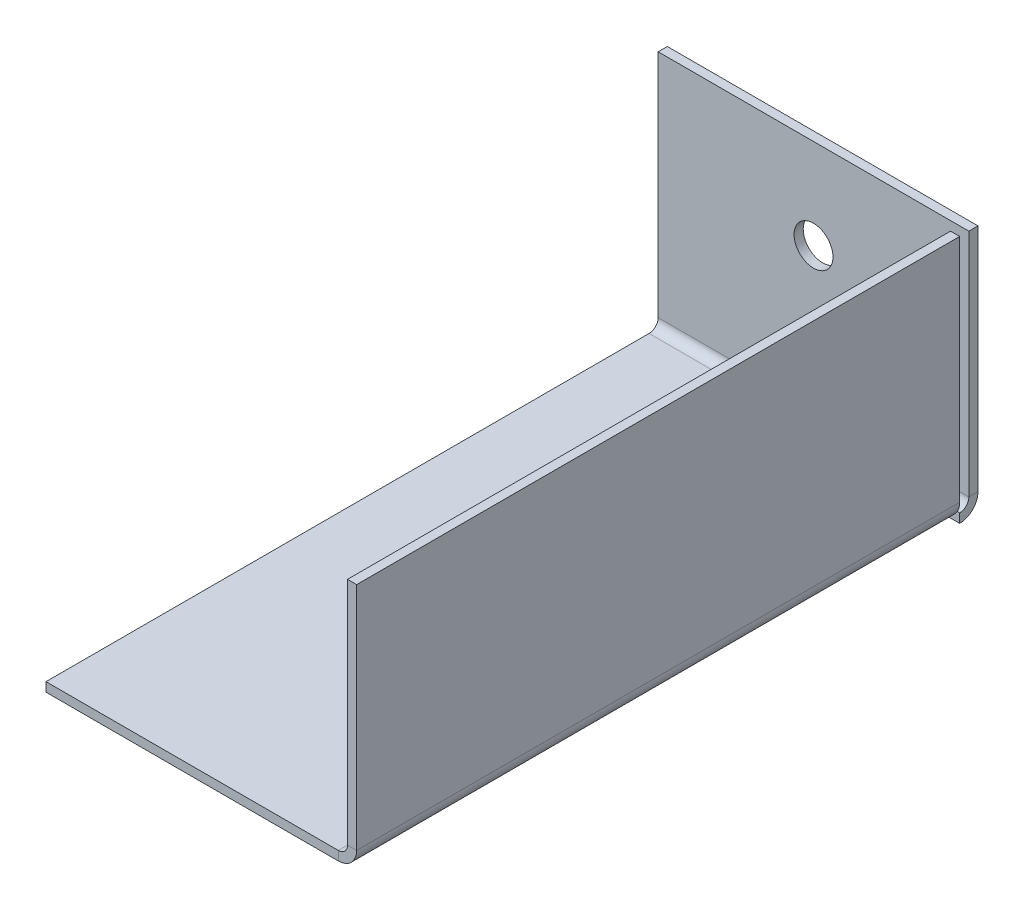
ISO-10303-21;
HEADER;
FILE_DESCRIPTION(('STEP AP214'),'2;1');
FILE_NAME('part.step','',(''),(''),'','','');
FILE_SCHEMA(('AUTOMOTIVE_DESIGN { 1 0 10303 214 1 1 1 1 }'));
ENDSEC;
DATA;
#1=APPLICATION_CONTEXT('core data for automotive mechanical design processes');
#2=APPLICATION_PROTOCOL_DEFINITION('international standard','automotive_design',2000,#1);
#3=PRODUCT_CONTEXT('',#1,'mechanical');
#4=PRODUCT('Part','Part','',(#3));
#5=PRODUCT_RELATED_PRODUCT_CATEGORY('part','',(#4));
#6=PRODUCT_DEFINITION_FORMATION('','',#4);
#7=PRODUCT_DEFINITION_CONTEXT('part definition',#1,'design');
#8=PRODUCT_DEFINITION('design','',#6,#7);
#9=PRODUCT_DEFINITION_SHAPE('','',#8);
#10=(LENGTH_UNIT() NAMED_UNIT(*) SI_UNIT(.MILLI.,.METRE.));
#11=(NAMED_UNIT(*) PLANE_ANGLE_UNIT() SI_UNIT($,.RADIAN.));
#12=(NAMED_UNIT(*) SI_UNIT($,.STERADIAN.) SOLID_ANGLE_UNIT());
#13=UNCERTAINTY_MEASURE_WITH_UNIT(LENGTH_MEASURE(1.E-05),#10,'distance_accuracy_value','');
#14=(GEOMETRIC_REPRESENTATION_CONTEXT(3) GLOBAL_UNCERTAINTY_ASSIGNED_CONTEXT((#13)) GLOBAL_UNIT_ASSIGNED_CONTEXT((#10,
#11,#12)) REPRESENTATION_CONTEXT('',''));
#15=CARTESIAN_POINT('',(0.,0.,0.));
#16=DIRECTION('',(0.,0.,1.));
#17=DIRECTION('',(1.,0.,0.));
#18=AXIS2_PLACEMENT_3D('',#15,#16,#17);
#19=CARTESIAN_POINT('',(12.5,0.,-23.5268));
#20=DIRECTION('',(0.,0.,1.));
#21=DIRECTION('',(0.,-1.,0.));
#22=AXIS2_PLACEMENT_3D('',#19,#20,#21);
#23=PLANE('',#22);
#24=DIRECTION('',(-1.,0.,0.));
#25=VECTOR('',#24,1.);
#26=CARTESIAN_POINT('',(12.5,0.,-23.5268));
#27=LINE('',#26,#25);
#28=CARTESIAN_POINT('',(12.5,0.,-23.5268));
#29=VERTEX_POINT('',#28);
#30=CARTESIAN_POINT('',(12.3026286248552,0.,-23.5268));
#31=VERTEX_POINT('',#30);
#32=EDGE_CURVE('E240',#29,#31,#27,.T.);
#33=ORIENTED_EDGE('',*,*,#32,.T.);
#34=CARTESIAN_POINT('',(11.0268,0.736599999999989,-23.5268));
#35=DIRECTION('',(0.,0.,-1.));
#36=DIRECTION('',(0.,1.,0.));
#37=AXIS2_PLACEMENT_3D('',#34,#35,#36);
#38=CIRCLE('',#37,1.4732);
#39=CARTESIAN_POINT('',(11.0268,-0.736600000000009,-23.5268));
#40=VERTEX_POINT('',#39);
#41=EDGE_CURVE('E13',#31,#40,#38,.T.);
#42=ORIENTED_EDGE('',*,*,#41,.T.);
#43=DIRECTION('',(-1.,0.,0.));
#44=VECTOR('',#43,1.);
#45=CARTESIAN_POINT('',(-12.5,-0.736600000000009,-23.5268));
#46=LINE('',#45,#44);
#47=CARTESIAN_POINT('',(12.5,-0.736600000000009,-23.5268));
#48=VERTEX_POINT('',#47);
#49=EDGE_CURVE('E242',#48,#40,#46,.T.);
#50=ORIENTED_EDGE('',*,*,#49,.F.);
#51=DIRECTION('',(0.,-1.,0.));
#52=VECTOR('',#51,1.);
#53=CARTESIAN_POINT('',(12.5,0.,-23.5268));
#54=LINE('',#53,#52);
#55=EDGE_CURVE('E299',#29,#48,#54,.T.);
#56=ORIENTED_EDGE('',*,*,#55,.F.);
#57=EDGE_LOOP('',(#33,#42,#50,#56));
#58=FACE_BOUND('',#57,.T.);
#59=ADVANCED_FACE('F79',(#58),#23,.T.);
#60=CARTESIAN_POINT('',(0.,-0.7366,0.));
#61=DIRECTION('',(0.,-1.,0.));
#62=DIRECTION('',(0.,0.,-1.));
#63=AXIS2_PLACEMENT_3D('',#60,#61,#62);
#64=PLANE('',#63);
#65=DIRECTION('',(-1.,0.,0.));
#66=VECTOR('',#65,1.);
#67=CARTESIAN_POINT('',(-12.5,-0.736600000000009,-23.5268));
#68=LINE('',#67,#66);
#69=CARTESIAN_POINT('',(-12.5,-0.736600000000009,-23.5268));
#70=VERTEX_POINT('',#69);
#71=EDGE_CURVE('E282',#70,#40,#68,.F.);
#72=ORIENTED_EDGE('',*,*,#71,.T.);
#73=DIRECTION('',(0.,0.,-1.));
#74=VECTOR('',#73,1.);
#75=CARTESIAN_POINT('',(11.0268,-0.736600000000011,-23.5268));
#76=LINE('',#75,#74);
#77=CARTESIAN_POINT('',(11.0268,-0.7366,25.));
#78=VERTEX_POINT('',#77);
#79=EDGE_CURVE('E222',#40,#78,#76,.F.);
#80=ORIENTED_EDGE('',*,*,#79,.T.);
#81=DIRECTION('',(1.,0.,0.));
#82=VECTOR('',#81,1.);
#83=CARTESIAN_POINT('',(-12.5,-0.7366,25.));
#84=LINE('',#83,#82);
#85=CARTESIAN_POINT('',(-12.5,-0.7366,25.));
#86=VERTEX_POINT('',#85);
#87=EDGE_CURVE('E305',#86,#78,#84,.T.);
#88=ORIENTED_EDGE('',*,*,#87,.F.);
#89=DIRECTION('',(0.,0.,1.));
#90=VECTOR('',#89,1.);
#91=CARTESIAN_POINT('',(-12.5,-0.7366,25.));
#92=LINE('',#91,#90);
#93=EDGE_CURVE('E105',#70,#86,#92,.T.);
#94=ORIENTED_EDGE('',*,*,#93,.F.);
#95=EDGE_LOOP('',(#72,#80,#88,#94));
#96=FACE_BOUND('',#95,.T.);
#97=ADVANCED_FACE('F349',(#96),#64,.T.);
#98=CARTESIAN_POINT('',(0.,0.,0.));
#99=DIRECTION('',(0.,-1.,0.));
#100=DIRECTION('',(0.,0.,-1.));
#101=AXIS2_PLACEMENT_3D('',#98,#99,#100);
#102=PLANE('',#101);
#103=DIRECTION('',(0.,0.,-1.));
#104=VECTOR('',#103,1.);
#105=CARTESIAN_POINT('',(11.0268,0.,-23.5268));
#106=LINE('',#105,#104);
#107=CARTESIAN_POINT('',(11.0268,0.,-23.5268));
#108=VERTEX_POINT('',#107);
#109=CARTESIAN_POINT('',(11.0268,0.,25.));
#110=VERTEX_POINT('',#109);
#111=EDGE_CURVE('E232',#108,#110,#106,.F.);
#112=ORIENTED_EDGE('',*,*,#111,.F.);
#113=DIRECTION('',(-1.,0.,0.));
#114=VECTOR('',#113,1.);
#115=CARTESIAN_POINT('',(-12.5,0.,-23.5268));
#116=LINE('',#115,#114);
#117=CARTESIAN_POINT('',(-12.5,0.,-23.5268));
#118=VERTEX_POINT('',#117);
#119=EDGE_CURVE('E295',#118,#108,#116,.F.);
#120=ORIENTED_EDGE('',*,*,#119,.F.);
#121=DIRECTION('',(0.,0.,1.));
#122=VECTOR('',#121,1.);
#123=CARTESIAN_POINT('',(-12.5,0.,25.));
#124=LINE('',#123,#122);
#125=CARTESIAN_POINT('',(-12.5,0.,25.));
#126=VERTEX_POINT('',#125);
#127=EDGE_CURVE('E302',#118,#126,#124,.T.);
#128=ORIENTED_EDGE('',*,*,#127,.T.);
#129=DIRECTION('',(1.,0.,0.));
#130=VECTOR('',#129,1.);
#131=CARTESIAN_POINT('',(-12.5,0.,25.));
#132=LINE('',#131,#130);
#133=EDGE_CURVE('E306',#126,#110,#132,.T.);
#134=ORIENTED_EDGE('',*,*,#133,.T.);
#135=EDGE_LOOP('',(#112,#120,#128,#134));
#136=FACE_BOUND('',#135,.T.);
#137=ADVANCED_FACE('F313',(#136),#102,.F.);
#138=CARTESIAN_POINT('',(-12.5,-0.7366,25.));
#139=DIRECTION('',(-1.,0.,0.));
#140=DIRECTION('',(0.,0.,1.));
#141=AXIS2_PLACEMENT_3D('',#138,#139,#140);
#142=PLANE('',#141);
#143=ORIENTED_EDGE('',*,*,#127,.F.);
#144=DIRECTION('',(0.,-1.,0.));
#145=VECTOR('',#144,1.);
#146=CARTESIAN_POINT('',(-12.5,0.,-23.5268));
#147=LINE('',#146,#145);
#148=EDGE_CURVE('E289',#118,#70,#147,.T.);
#149=ORIENTED_EDGE('',*,*,#148,.T.);
#150=ORIENTED_EDGE('',*,*,#93,.T.);
#151=DIRECTION('',(0.,1.,0.));
#152=VECTOR('',#151,1.);
#153=CARTESIAN_POINT('',(-12.5,-0.7366,25.));
#154=LINE('',#153,#152);
#155=EDGE_CURVE('E83',#86,#126,#154,.T.);
#156=ORIENTED_EDGE('',*,*,#155,.T.);
#157=EDGE_LOOP('',(#143,#149,#150,#156));
#158=FACE_BOUND('',#157,.T.);
#159=ADVANCED_FACE('F81',(#158),#142,.T.);
#160=CARTESIAN_POINT('',(-12.5,-0.7366,25.));
#161=DIRECTION('',(0.,0.,1.));
#162=DIRECTION('',(1.,0.,0.));
#163=AXIS2_PLACEMENT_3D('',#160,#161,#162);
#164=PLANE('',#163);
#165=DIRECTION('',(0.,-1.,0.));
#166=VECTOR('',#165,1.);
#167=CARTESIAN_POINT('',(11.0268,0.,25.));
#168=LINE('',#167,#166);
#169=EDGE_CURVE('E226',#110,#78,#168,.T.);
#170=ORIENTED_EDGE('',*,*,#169,.F.);
#171=ORIENTED_EDGE('',*,*,#133,.F.);
#172=ORIENTED_EDGE('',*,*,#155,.F.);
#173=ORIENTED_EDGE('',*,*,#87,.T.);
#174=EDGE_LOOP('',(#170,#171,#172,#173));
#175=FACE_BOUND('',#174,.T.);
#176=ADVANCED_FACE('F391',(#175),#164,.T.);
#177=CARTESIAN_POINT('',(12.5,0.736599999999992,-23.5268));
#178=DIRECTION('',(1.,0.,0.));
#179=DIRECTION('',(0.,0.,-1.));
#180=AXIS2_PLACEMENT_3D('',#177,#178,#179);
#181=PLANE('',#180);
#182=DIRECTION('',(0.,0.,1.));
#183=VECTOR('',#182,1.);
#184=CARTESIAN_POINT('',(12.5,0.736600000000002,-25.));
#185=LINE('',#184,#183);
#186=CARTESIAN_POINT('',(12.5,0.736599999999989,-24.2634));
#187=VERTEX_POINT('',#186);
#188=CARTESIAN_POINT('',(12.5,0.736599999999987,-25.));
#189=VERTEX_POINT('',#188);
#190=EDGE_CURVE('E245',#187,#189,#185,.F.);
#191=ORIENTED_EDGE('',*,*,#190,.F.);
#192=CARTESIAN_POINT('',(12.5,0.736599999999992,-23.5268));
#193=DIRECTION('',(-1.,0.,0.));
#194=DIRECTION('',(0.,0.,1.));
#195=AXIS2_PLACEMENT_3D('',#192,#193,#194);
#196=CIRCLE('',#195,0.7366);
#197=EDGE_CURVE('E292',#29,#187,#196,.F.);
#198=ORIENTED_EDGE('',*,*,#197,.F.);
#199=ORIENTED_EDGE('',*,*,#55,.T.);
#200=CARTESIAN_POINT('',(12.5,0.736599999999992,-23.5268));
#201=DIRECTION('',(-1.,0.,0.));
#202=DIRECTION('',(0.,0.,1.));
#203=AXIS2_PLACEMENT_3D('',#200,#201,#202);
#204=CIRCLE('',#203,1.4732);
#205=EDGE_CURVE('E285',#48,#189,#204,.F.);
#206=ORIENTED_EDGE('',*,*,#205,.T.);
#207=EDGE_LOOP('',(#191,#198,#199,#206));
#208=FACE_BOUND('',#207,.T.);
#209=ADVANCED_FACE('F388',(#208),#181,.T.);
#210=CARTESIAN_POINT('',(-12.5,0.736599999999992,-23.5268));
#211=DIRECTION('',(1.,0.,0.));
#212=DIRECTION('',(0.,0.,-1.));
#213=AXIS2_PLACEMENT_3D('',#210,#211,#212);
#214=PLANE('',#213);
#215=CARTESIAN_POINT('',(-12.5,0.736599999999992,-23.5268));
#216=DIRECTION('',(-1.,0.,0.));
#217=DIRECTION('',(0.,0.,1.));
#218=AXIS2_PLACEMENT_3D('',#215,#216,#217);
#219=CIRCLE('',#218,0.7366);
#220=CARTESIAN_POINT('',(-12.5,0.736599999999989,-24.2634));
#221=VERTEX_POINT('',#220);
#222=EDGE_CURVE('E249',#221,#118,#219,.T.);
#223=ORIENTED_EDGE('',*,*,#222,.F.);
#224=DIRECTION('',(0.,0.,1.));
#225=VECTOR('',#224,1.);
#226=CARTESIAN_POINT('',(-12.5,0.736599999999997,-24.2634));
#227=LINE('',#226,#225);
#228=CARTESIAN_POINT('',(-12.5,0.736600000000002,-25.));
#229=VERTEX_POINT('',#228);
#230=EDGE_CURVE('E275',#221,#229,#227,.F.);
#231=ORIENTED_EDGE('',*,*,#230,.T.);
#232=CARTESIAN_POINT('',(-12.5,0.736599999999992,-23.5268));
#233=DIRECTION('',(-1.,0.,0.));
#234=DIRECTION('',(0.,0.,1.));
#235=AXIS2_PLACEMENT_3D('',#232,#233,#234);
#236=CIRCLE('',#235,1.4732);
#237=EDGE_CURVE('E286',#229,#70,#236,.T.);
#238=ORIENTED_EDGE('',*,*,#237,.T.);
#239=ORIENTED_EDGE('',*,*,#148,.F.);
#240=EDGE_LOOP('',(#223,#231,#238,#239));
#241=FACE_BOUND('',#240,.T.);
#242=ADVANCED_FACE('F384',(#241),#214,.F.);
#243=CARTESIAN_POINT('',(-12.5,0.736599999999992,-23.5268));
#244=DIRECTION('',(-1.,0.,0.));
#245=DIRECTION('',(0.,0.,-1.));
#246=AXIS2_PLACEMENT_3D('',#243,#244,#245);
#247=CYLINDRICAL_SURFACE('',#246,1.4732);
#248=ORIENTED_EDGE('',*,*,#71,.F.);
#249=ORIENTED_EDGE('',*,*,#237,.F.);
#250=DIRECTION('',(-1.,0.,0.));
#251=VECTOR('',#250,1.);
#252=CARTESIAN_POINT('',(12.5,0.736600000000002,-25.));
#253=LINE('',#252,#251);
#254=EDGE_CURVE('E273',#229,#189,#253,.F.);
#255=ORIENTED_EDGE('',*,*,#254,.T.);
#256=ORIENTED_EDGE('',*,*,#205,.F.);
#257=ORIENTED_EDGE('',*,*,#49,.T.);
#258=EDGE_LOOP('',(#248,#249,#255,#256,#257));
#259=FACE_BOUND('',#258,.T.);
#260=ADVANCED_FACE('F381',(#259),#247,.T.);
#261=CARTESIAN_POINT('',(-12.5,0.736599999999992,-23.5268));
#262=DIRECTION('',(-1.,0.,0.));
#263=DIRECTION('',(0.,0.,-1.));
#264=AXIS2_PLACEMENT_3D('',#261,#262,#263);
#265=CYLINDRICAL_SURFACE('',#264,0.7366);
#266=ORIENTED_EDGE('',*,*,#119,.T.);
#267=EDGE_CURVE('E96',#31,#108,#27,.T.);
#268=ORIENTED_EDGE('',*,*,#267,.F.);
#269=ORIENTED_EDGE('',*,*,#32,.F.);
#270=ORIENTED_EDGE('',*,*,#197,.T.);
#271=DIRECTION('',(-1.,0.,0.));
#272=VECTOR('',#271,1.);
#273=CARTESIAN_POINT('',(12.5,0.736599999999997,-24.2634));
#274=LINE('',#273,#272);
#275=EDGE_CURVE('E278',#187,#221,#274,.T.);
#276=ORIENTED_EDGE('',*,*,#275,.T.);
#277=ORIENTED_EDGE('',*,*,#222,.T.);
#278=EDGE_LOOP('',(#266,#268,#269,#270,#276,#277));
#279=FACE_BOUND('',#278,.T.);
#280=ADVANCED_FACE('F365',(#279),#265,.F.);
#281=CARTESIAN_POINT('',(0.,0.,-25.));
#282=DIRECTION('',(0.,0.,1.));
#283=DIRECTION('',(0.,-1.,0.));
#284=AXIS2_PLACEMENT_3D('',#281,#282,#283);
#285=PLANE('',#284);
#286=CARTESIAN_POINT('',(0.,12.,-25.));
#287=DIRECTION('',(0.,0.,1.));
#288=DIRECTION('',(0.,-1.,0.));
#289=AXIS2_PLACEMENT_3D('',#286,#287,#288);
#290=CIRCLE('',#289,1.565);
#291=CARTESIAN_POINT('',(0.,10.435,-25.));
#292=VERTEX_POINT('',#291);
#293=EDGE_CURVE('E267',#292,#292,#290,.F.);
#294=ORIENTED_EDGE('',*,*,#293,.F.);
#295=EDGE_LOOP('',(#294));
#296=FACE_BOUND('',#295,.T.);
#297=ORIENTED_EDGE('',*,*,#254,.F.);
#298=DIRECTION('',(0.,1.,0.));
#299=VECTOR('',#298,1.);
#300=CARTESIAN_POINT('',(-12.5,0.,-25.));
#301=LINE('',#300,#299);
#302=CARTESIAN_POINT('',(-12.5,19.2634,-25.0000000000001));
#303=VERTEX_POINT('',#302);
#304=EDGE_CURVE('E255',#229,#303,#301,.T.);
#305=ORIENTED_EDGE('',*,*,#304,.T.);
#306=DIRECTION('',(1.,0.,0.));
#307=VECTOR('',#306,1.);
#308=CARTESIAN_POINT('',(0.,19.2634,-25.0000000000001));
#309=LINE('',#308,#307);
#310=CARTESIAN_POINT('',(12.5,19.2634,-25.0000000000001));
#311=VERTEX_POINT('',#310);
#312=EDGE_CURVE('E253',#303,#311,#309,.T.);
#313=ORIENTED_EDGE('',*,*,#312,.T.);
#314=DIRECTION('',(0.,-1.,0.));
#315=VECTOR('',#314,1.);
#316=CARTESIAN_POINT('',(12.5,0.,-25.));
#317=LINE('',#316,#315);
#318=EDGE_CURVE('E257',#311,#189,#317,.T.);
#319=ORIENTED_EDGE('',*,*,#318,.T.);
#320=EDGE_LOOP('',(#297,#305,#313,#319));
#321=FACE_BOUND('',#320,.T.);
#322=ADVANCED_FACE('F361',(#296,#321),#285,.F.);
#323=CARTESIAN_POINT('',(0.,0.,-24.2634));
#324=DIRECTION('',(0.,0.,1.));
#325=DIRECTION('',(0.,-1.,0.));
#326=AXIS2_PLACEMENT_3D('',#323,#324,#325);
#327=PLANE('',#326);
#328=CARTESIAN_POINT('',(0.,12.,-24.2634000000001));
#329=DIRECTION('',(0.,0.,1.));
#330=DIRECTION('',(0.,-1.,0.));
#331=AXIS2_PLACEMENT_3D('',#328,#329,#330);
#332=CIRCLE('',#331,1.565);
#333=CARTESIAN_POINT('',(0.,10.435,-24.2634));
#334=VERTEX_POINT('',#333);
#335=EDGE_CURVE('E270',#334,#334,#332,.F.);
#336=ORIENTED_EDGE('',*,*,#335,.T.);
#337=EDGE_LOOP('',(#336));
#338=FACE_BOUND('',#337,.T.);
#339=DIRECTION('',(0.,-1.,0.));
#340=VECTOR('',#339,1.);
#341=CARTESIAN_POINT('',(-12.5,19.2634,-24.2634000000001));
#342=LINE('',#341,#340);
#343=CARTESIAN_POINT('',(-12.5,19.2634,-24.2634000000001));
#344=VERTEX_POINT('',#343);
#345=EDGE_CURVE('E262',#221,#344,#342,.F.);
#346=ORIENTED_EDGE('',*,*,#345,.F.);
#347=ORIENTED_EDGE('',*,*,#275,.F.);
#348=DIRECTION('',(0.,1.,0.));
#349=VECTOR('',#348,1.);
#350=CARTESIAN_POINT('',(12.5,0.,-24.2634));
#351=LINE('',#350,#349);
#352=CARTESIAN_POINT('',(12.5,19.2634,-24.2634000000001));
#353=VERTEX_POINT('',#352);
#354=EDGE_CURVE('E264',#353,#187,#351,.F.);
#355=ORIENTED_EDGE('',*,*,#354,.F.);
#356=DIRECTION('',(-1.,0.,0.));
#357=VECTOR('',#356,1.);
#358=CARTESIAN_POINT('',(12.5,19.2634,-24.2634000000001));
#359=LINE('',#358,#357);
#360=EDGE_CURVE('E260',#344,#353,#359,.F.);
#361=ORIENTED_EDGE('',*,*,#360,.F.);
#362=EDGE_LOOP('',(#346,#347,#355,#361));
#363=FACE_BOUND('',#362,.T.);
#364=ADVANCED_FACE('F364',(#338,#363),#327,.T.);
#365=CARTESIAN_POINT('',(12.5,0.,-25.));
#366=DIRECTION('',(-1.,0.,0.));
#367=DIRECTION('',(0.,0.,1.));
#368=AXIS2_PLACEMENT_3D('',#365,#366,#367);
#369=PLANE('',#368);
#370=ORIENTED_EDGE('',*,*,#190,.T.);
#371=ORIENTED_EDGE('',*,*,#318,.F.);
#372=DIRECTION('',(0.,0.,1.));
#373=VECTOR('',#372,1.);
#374=CARTESIAN_POINT('',(12.5,19.2634,-25.0000000000001));
#375=LINE('',#374,#373);
#376=EDGE_CURVE('E250',#311,#353,#375,.T.);
#377=ORIENTED_EDGE('',*,*,#376,.T.);
#378=ORIENTED_EDGE('',*,*,#354,.T.);
#379=EDGE_LOOP('',(#370,#371,#377,#378));
#380=FACE_BOUND('',#379,.T.);
#381=ADVANCED_FACE('F369',(#380),#369,.F.);
#382=CARTESIAN_POINT('',(-12.5,19.2634,-25.0000000000001));
#383=DIRECTION('',(1.,0.,0.));
#384=DIRECTION('',(0.,1.,0.));
#385=AXIS2_PLACEMENT_3D('',#382,#383,#384);
#386=PLANE('',#385);
#387=ORIENTED_EDGE('',*,*,#230,.F.);
#388=ORIENTED_EDGE('',*,*,#345,.T.);
#389=DIRECTION('',(0.,0.,1.));
#390=VECTOR('',#389,1.);
#391=CARTESIAN_POINT('',(-12.5,19.2634,-25.0000000000001));
#392=LINE('',#391,#390);
#393=EDGE_CURVE('E246',#303,#344,#392,.T.);
#394=ORIENTED_EDGE('',*,*,#393,.F.);
#395=ORIENTED_EDGE('',*,*,#304,.F.);
#396=EDGE_LOOP('',(#387,#388,#394,#395));
#397=FACE_BOUND('',#396,.T.);
#398=ADVANCED_FACE('F373',(#397),#386,.F.);
#399=CARTESIAN_POINT('',(12.5,19.2634,-25.0000000000001));
#400=DIRECTION('',(0.,-1.,0.));
#401=DIRECTION('',(0.,0.,-1.));
#402=AXIS2_PLACEMENT_3D('',#399,#400,#401);
#403=PLANE('',#402);
#404=ORIENTED_EDGE('',*,*,#360,.T.);
#405=ORIENTED_EDGE('',*,*,#376,.F.);
#406=ORIENTED_EDGE('',*,*,#312,.F.);
#407=ORIENTED_EDGE('',*,*,#393,.T.);
#408=EDGE_LOOP('',(#404,#405,#406,#407));
#409=FACE_BOUND('',#408,.T.);
#410=ADVANCED_FACE('F359',(#409),#403,.F.);
#411=CARTESIAN_POINT('',(0.,12.,-25.));
#412=DIRECTION('',(0.,0.,1.));
#413=DIRECTION('',(0.,-1.,0.));
#414=AXIS2_PLACEMENT_3D('',#411,#412,#413);
#415=CYLINDRICAL_SURFACE('',#414,1.565);
#416=ORIENTED_EDGE('',*,*,#293,.T.);
#417=EDGE_LOOP('',(#416));
#418=FACE_BOUND('',#417,.T.);
#419=ORIENTED_EDGE('',*,*,#335,.F.);
#420=EDGE_LOOP('',(#419));
#421=FACE_BOUND('',#420,.T.);
#422=ADVANCED_FACE('F345',(#418,#421),#415,.F.);
#423=CARTESIAN_POINT('',(11.0268,0.7366,25.));
#424=DIRECTION('',(0.,0.,1.));
#425=DIRECTION('',(0.,-1.,0.));
#426=AXIS2_PLACEMENT_3D('',#423,#424,#425);
#427=PLANE('',#426);
#428=DIRECTION('',(-1.,0.,0.));
#429=VECTOR('',#428,1.);
#430=CARTESIAN_POINT('',(12.5,0.736599999999994,25.));
#431=LINE('',#430,#429);
#432=CARTESIAN_POINT('',(11.7634,0.736599999999997,25.));
#433=VERTEX_POINT('',#432);
#434=CARTESIAN_POINT('',(12.5,0.736599999999994,25.));
#435=VERTEX_POINT('',#434);
#436=EDGE_CURVE('E205',#433,#435,#431,.F.);
#437=ORIENTED_EDGE('',*,*,#436,.F.);
#438=CARTESIAN_POINT('',(11.0268,0.7366,25.));
#439=DIRECTION('',(0.,0.,-1.));
#440=DIRECTION('',(0.,1.,0.));
#441=AXIS2_PLACEMENT_3D('',#438,#439,#440);
#442=CIRCLE('',#441,0.7366);
#443=EDGE_CURVE('E229',#110,#433,#442,.F.);
#444=ORIENTED_EDGE('',*,*,#443,.F.);
#445=ORIENTED_EDGE('',*,*,#169,.T.);
#446=CARTESIAN_POINT('',(11.0268,0.7366,25.));
#447=DIRECTION('',(0.,0.,-1.));
#448=DIRECTION('',(0.,1.,0.));
#449=AXIS2_PLACEMENT_3D('',#446,#447,#448);
#450=CIRCLE('',#449,1.4732);
#451=EDGE_CURVE('E224',#78,#435,#450,.F.);
#452=ORIENTED_EDGE('',*,*,#451,.T.);
#453=EDGE_LOOP('',(#437,#444,#445,#452));
#454=FACE_BOUND('',#453,.T.);
#455=ADVANCED_FACE('F323',(#454),#427,.T.);
#456=CARTESIAN_POINT('',(11.0268,0.736599999999989,-23.5268));
#457=DIRECTION('',(0.,0.,1.));
#458=DIRECTION('',(0.,-1.,0.));
#459=AXIS2_PLACEMENT_3D('',#456,#457,#458);
#460=PLANE('',#459);
#461=CARTESIAN_POINT('',(12.5,0.736599999999984,-23.5268));
#462=VERTEX_POINT('',#461);
#463=EDGE_CURVE('E89',#462,#31,#38,.T.);
#464=ORIENTED_EDGE('',*,*,#463,.T.);
#465=ORIENTED_EDGE('',*,*,#267,.T.);
#466=CARTESIAN_POINT('',(11.0268,0.736599999999989,-23.5268));
#467=DIRECTION('',(0.,0.,-1.));
#468=DIRECTION('',(0.,1.,0.));
#469=AXIS2_PLACEMENT_3D('',#466,#467,#468);
#470=CIRCLE('',#469,0.7366);
#471=CARTESIAN_POINT('',(11.7634,0.736599999999986,-23.5268));
#472=VERTEX_POINT('',#471);
#473=EDGE_CURVE('E235',#472,#108,#470,.T.);
#474=ORIENTED_EDGE('',*,*,#473,.F.);
#475=DIRECTION('',(-1.,0.,0.));
#476=VECTOR('',#475,1.);
#477=CARTESIAN_POINT('',(11.7634,0.736599999999987,-23.5268));
#478=LINE('',#477,#476);
#479=EDGE_CURVE('E216',#472,#462,#478,.F.);
#480=ORIENTED_EDGE('',*,*,#479,.T.);
#481=EDGE_LOOP('',(#464,#465,#474,#480));
#482=FACE_BOUND('',#481,.T.);
#483=ADVANCED_FACE('F337',(#482),#460,.F.);
#484=CARTESIAN_POINT('',(11.0268,0.736599999999989,-23.5268));
#485=DIRECTION('',(0.,0.,-1.));
#486=DIRECTION('',(1.,0.,0.));
#487=AXIS2_PLACEMENT_3D('',#484,#485,#486);
#488=CYLINDRICAL_SURFACE('',#487,1.4732);
#489=ORIENTED_EDGE('',*,*,#79,.F.);
#490=ORIENTED_EDGE('',*,*,#41,.F.);
#491=ORIENTED_EDGE('',*,*,#463,.F.);
#492=DIRECTION('',(0.,0.,-1.));
#493=VECTOR('',#492,1.);
#494=CARTESIAN_POINT('',(12.5,0.736599999999994,25.));
#495=LINE('',#494,#493);
#496=EDGE_CURVE('E214',#462,#435,#495,.F.);
#497=ORIENTED_EDGE('',*,*,#496,.T.);
#498=ORIENTED_EDGE('',*,*,#451,.F.);
#499=EDGE_LOOP('',(#489,#490,#491,#497,#498));
#500=FACE_BOUND('',#499,.T.);
#501=ADVANCED_FACE('F327',(#500),#488,.T.);
#502=CARTESIAN_POINT('',(11.0268,0.736599999999989,-23.5268));
#503=DIRECTION('',(0.,0.,-1.));
#504=DIRECTION('',(1.,0.,0.));
#505=AXIS2_PLACEMENT_3D('',#502,#503,#504);
#506=CYLINDRICAL_SURFACE('',#505,0.7366);
#507=ORIENTED_EDGE('',*,*,#111,.T.);
#508=ORIENTED_EDGE('',*,*,#443,.T.);
#509=DIRECTION('',(0.,0.,-1.));
#510=VECTOR('',#509,1.);
#511=CARTESIAN_POINT('',(11.7634,0.736599999999997,25.));
#512=LINE('',#511,#510);
#513=EDGE_CURVE('E219',#433,#472,#512,.T.);
#514=ORIENTED_EDGE('',*,*,#513,.T.);
#515=ORIENTED_EDGE('',*,*,#473,.T.);
#516=EDGE_LOOP('',(#507,#508,#514,#515));
#517=FACE_BOUND('',#516,.T.);
#518=ADVANCED_FACE('F319',(#517),#506,.F.);
#519=CARTESIAN_POINT('',(12.5,0.,25.));
#520=DIRECTION('',(0.,0.,-1.));
#521=DIRECTION('',(0.,1.,0.));
#522=AXIS2_PLACEMENT_3D('',#519,#520,#521);
#523=PLANE('',#522);
#524=ORIENTED_EDGE('',*,*,#436,.T.);
#525=DIRECTION('',(0.,-1.,0.));
#526=VECTOR('',#525,1.);
#527=CARTESIAN_POINT('',(12.5,0.,25.));
#528=LINE('',#527,#526);
#529=CARTESIAN_POINT('',(12.5000000000001,19.2634,25.));
#530=VERTEX_POINT('',#529);
#531=EDGE_CURVE('E186',#530,#435,#528,.T.);
#532=ORIENTED_EDGE('',*,*,#531,.F.);
#533=DIRECTION('',(-1.,0.,0.));
#534=VECTOR('',#533,1.);
#535=CARTESIAN_POINT('',(12.5000000000001,19.2634,25.));
#536=LINE('',#535,#534);
#537=CARTESIAN_POINT('',(11.7634000000001,19.2634,25.));
#538=VERTEX_POINT('',#537);
#539=EDGE_CURVE('E192',#530,#538,#536,.T.);
#540=ORIENTED_EDGE('',*,*,#539,.T.);
#541=DIRECTION('',(0.,1.,0.));
#542=VECTOR('',#541,1.);
#543=CARTESIAN_POINT('',(11.7634,0.,25.));
#544=LINE('',#543,#542);
#545=EDGE_CURVE('E212',#538,#433,#544,.F.);
#546=ORIENTED_EDGE('',*,*,#545,.T.);
#547=EDGE_LOOP('',(#524,#532,#540,#546));
#548=FACE_BOUND('',#547,.T.);
#549=ADVANCED_FACE('F204',(#548),#523,.F.);
#550=CARTESIAN_POINT('',(12.5000000000001,19.2634,-23.5268));
#551=DIRECTION('',(0.,0.,1.));
#552=DIRECTION('',(0.,-1.,0.));
#553=AXIS2_PLACEMENT_3D('',#550,#551,#552);
#554=PLANE('',#553);
#555=ORIENTED_EDGE('',*,*,#479,.F.);
#556=DIRECTION('',(0.,-1.,0.));
#557=VECTOR('',#556,1.);
#558=CARTESIAN_POINT('',(11.7634000000001,19.2634,-23.5268));
#559=LINE('',#558,#557);
#560=CARTESIAN_POINT('',(11.7634000000001,19.2634,-23.5268));
#561=VERTEX_POINT('',#560);
#562=EDGE_CURVE('E208',#472,#561,#559,.F.);
#563=ORIENTED_EDGE('',*,*,#562,.T.);
#564=DIRECTION('',(-1.,0.,0.));
#565=VECTOR('',#564,1.);
#566=CARTESIAN_POINT('',(12.5000000000001,19.2634,-23.5268));
#567=LINE('',#566,#565);
#568=CARTESIAN_POINT('',(12.5000000000001,19.2634,-23.5268));
#569=VERTEX_POINT('',#568);
#570=EDGE_CURVE('E201',#569,#561,#567,.T.);
#571=ORIENTED_EDGE('',*,*,#570,.F.);
#572=DIRECTION('',(0.,1.,0.));
#573=VECTOR('',#572,1.);
#574=CARTESIAN_POINT('',(12.5,0.,-23.5268));
#575=LINE('',#574,#573);
#576=EDGE_CURVE('E188',#462,#569,#575,.T.);
#577=ORIENTED_EDGE('',*,*,#576,.F.);
#578=EDGE_LOOP('',(#555,#563,#571,#577));
#579=FACE_BOUND('',#578,.T.);
#580=ADVANCED_FACE('F331',(#579),#554,.F.);
#581=CARTESIAN_POINT('',(12.5,0.,0.));
#582=DIRECTION('',(-1.,0.,0.));
#583=DIRECTION('',(0.,-1.,0.));
#584=AXIS2_PLACEMENT_3D('',#581,#582,#583);
#585=PLANE('',#584);
#586=ORIENTED_EDGE('',*,*,#496,.F.);
#587=ORIENTED_EDGE('',*,*,#576,.T.);
#588=DIRECTION('',(0.,0.,1.));
#589=VECTOR('',#588,1.);
#590=CARTESIAN_POINT('',(12.5000000000001,19.2634,0.));
#591=LINE('',#590,#589);
#592=EDGE_CURVE('E181',#569,#530,#591,.T.);
#593=ORIENTED_EDGE('',*,*,#592,.T.);
#594=ORIENTED_EDGE('',*,*,#531,.T.);
#595=EDGE_LOOP('',(#586,#587,#593,#594));
#596=FACE_BOUND('',#595,.T.);
#597=ADVANCED_FACE('F184',(#596),#585,.F.);
#598=CARTESIAN_POINT('',(11.7634,0.,0.));
#599=DIRECTION('',(-1.,0.,0.));
#600=DIRECTION('',(0.,-1.,0.));
#601=AXIS2_PLACEMENT_3D('',#598,#599,#600);
#602=PLANE('',#601);
#603=ORIENTED_EDGE('',*,*,#562,.F.);
#604=ORIENTED_EDGE('',*,*,#513,.F.);
#605=ORIENTED_EDGE('',*,*,#545,.F.);
#606=DIRECTION('',(0.,0.,-1.));
#607=VECTOR('',#606,1.);
#608=CARTESIAN_POINT('',(11.7634000000001,19.2634,25.));
#609=LINE('',#608,#607);
#610=EDGE_CURVE('E197',#561,#538,#609,.F.);
#611=ORIENTED_EDGE('',*,*,#610,.F.);
#612=EDGE_LOOP('',(#603,#604,#605,#611));
#613=FACE_BOUND('',#612,.T.);
#614=ADVANCED_FACE('F335',(#613),#602,.T.);
#615=CARTESIAN_POINT('',(12.5000000000001,19.2634,25.));
#616=DIRECTION('',(0.,-1.,0.));
#617=DIRECTION('',(1.,0.,0.));
#618=AXIS2_PLACEMENT_3D('',#615,#616,#617);
#619=PLANE('',#618);
#620=ORIENTED_EDGE('',*,*,#610,.T.);
#621=ORIENTED_EDGE('',*,*,#539,.F.);
#622=ORIENTED_EDGE('',*,*,#592,.F.);
#623=ORIENTED_EDGE('',*,*,#570,.T.);
#624=EDGE_LOOP('',(#620,#621,#622,#623));
#625=FACE_BOUND('',#624,.T.);
#626=ADVANCED_FACE('F195',(#625),#619,.F.);
#627=CLOSED_SHELL('',(#59,#97,#137,#159,#176,#209,#242,#260,#280,#322,#364,#381,#398,#410,#422,
#455,#483,#501,#518,#549,#580,#597,#614,#626));
#628=MANIFOLD_SOLID_BREP('B2',#627);
#629=ADVANCED_BREP_SHAPE_REPRESENTATION('',(#18,#628),#14);
#630=SHAPE_DEFINITION_REPRESENTATION(#9,#629);
ENDSEC;
END-ISO-10303-21;
